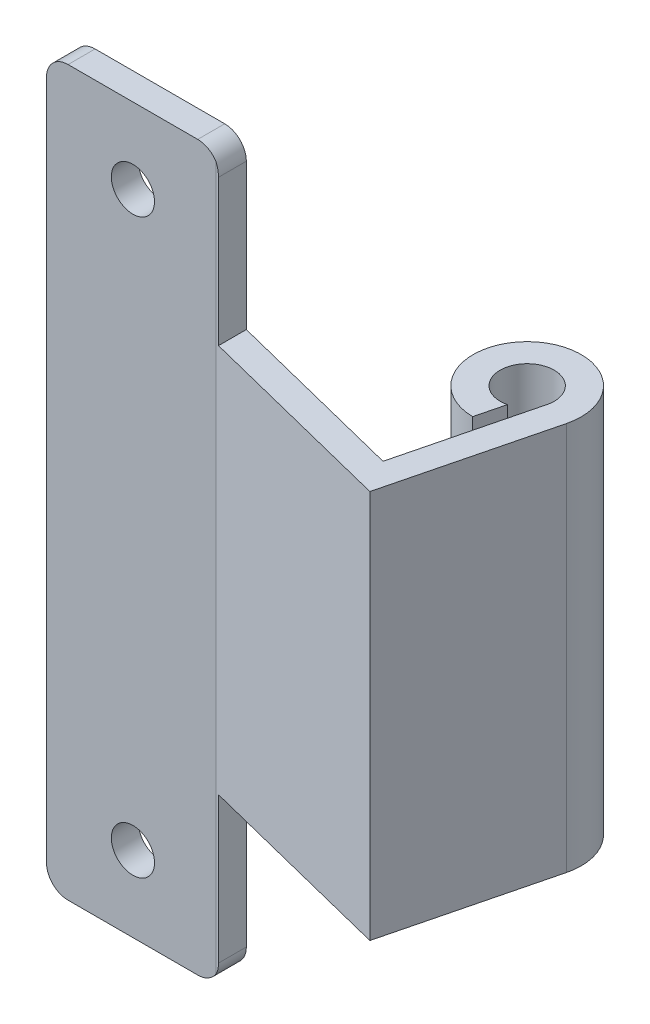
ISO-10303-21;
HEADER;
FILE_DESCRIPTION(('STEP AP214'),'2;1');
FILE_NAME('part.step','',(''),(''),'','','');
FILE_SCHEMA(('AUTOMOTIVE_DESIGN { 1 0 10303 214 1 1 1 1 }'));
ENDSEC;
DATA;
#1=APPLICATION_CONTEXT('core data for automotive mechanical design processes');
#2=APPLICATION_PROTOCOL_DEFINITION('international standard','automotive_design',2000,#1);
#3=PRODUCT_CONTEXT('',#1,'mechanical');
#4=PRODUCT('Part','Part','',(#3));
#5=PRODUCT_RELATED_PRODUCT_CATEGORY('part','',(#4));
#6=PRODUCT_DEFINITION_FORMATION('','',#4);
#7=PRODUCT_DEFINITION_CONTEXT('part definition',#1,'design');
#8=PRODUCT_DEFINITION('design','',#6,#7);
#9=PRODUCT_DEFINITION_SHAPE('','',#8);
#10=(LENGTH_UNIT() NAMED_UNIT(*) SI_UNIT(.MILLI.,.METRE.));
#11=(NAMED_UNIT(*) PLANE_ANGLE_UNIT() SI_UNIT($,.RADIAN.));
#12=(NAMED_UNIT(*) SI_UNIT($,.STERADIAN.) SOLID_ANGLE_UNIT());
#13=UNCERTAINTY_MEASURE_WITH_UNIT(LENGTH_MEASURE(1.E-05),#10,'distance_accuracy_value','');
#14=(GEOMETRIC_REPRESENTATION_CONTEXT(3) GLOBAL_UNCERTAINTY_ASSIGNED_CONTEXT((#13)) GLOBAL_UNIT_ASSIGNED_CONTEXT((#10,
#11,#12)) REPRESENTATION_CONTEXT('',''));
#15=CARTESIAN_POINT('',(0.,0.,0.));
#16=DIRECTION('',(0.,0.,1.));
#17=DIRECTION('',(1.,0.,0.));
#18=AXIS2_PLACEMENT_3D('',#15,#16,#17);
#19=CARTESIAN_POINT('',(0.,33.5,0.));
#20=DIRECTION('',(0.,-1.,0.));
#21=DIRECTION('',(0.,0.,-1.));
#22=AXIS2_PLACEMENT_3D('',#19,#20,#21);
#23=CYLINDRICAL_SURFACE('',#22,5.);
#24=CARTESIAN_POINT('',(0.,18.,0.));
#25=DIRECTION('',(0.,-1.,0.));
#26=DIRECTION('',(1.,0.,0.));
#27=AXIS2_PLACEMENT_3D('',#24,#25,#26);
#28=CIRCLE('',#27,5.);
#29=CARTESIAN_POINT('',(-0.0442396130389852,18.,4.99980428183326));
#30=VERTEX_POINT('',#29);
#31=CARTESIAN_POINT('',(4.84994585902011,18.,1.21574058276166));
#32=VERTEX_POINT('',#31);
#33=EDGE_CURVE('E345',#30,#32,#28,.T.);
#34=ORIENTED_EDGE('',*,*,#33,.T.);
#35=DIRECTION('',(0.,-1.,0.));
#36=VECTOR('',#35,1.);
#37=CARTESIAN_POINT('',(4.84994585902011,33.5,1.21574058276166));
#38=LINE('',#37,#36);
#39=CARTESIAN_POINT('',(4.84994585902011,-18.,1.21574058276166));
#40=VERTEX_POINT('',#39);
#41=EDGE_CURVE('E181',#32,#40,#38,.T.);
#42=ORIENTED_EDGE('',*,*,#41,.T.);
#43=CARTESIAN_POINT('',(0.,-18.,0.));
#44=DIRECTION('',(0.,1.,0.));
#45=DIRECTION('',(-1.,0.,0.));
#46=AXIS2_PLACEMENT_3D('',#43,#44,#45);
#47=CIRCLE('',#46,5.);
#48=CARTESIAN_POINT('',(-0.0442396130389852,-18.,4.99980428183326));
#49=VERTEX_POINT('',#48);
#50=EDGE_CURVE('E159',#40,#49,#47,.T.);
#51=ORIENTED_EDGE('',*,*,#50,.T.);
#52=DIRECTION('',(0.,-1.,0.));
#53=VECTOR('',#52,1.);
#54=CARTESIAN_POINT('',(-0.0442396130389852,33.5,4.99980428183326));
#55=LINE('',#54,#53);
#56=EDGE_CURVE('E165',#30,#49,#55,.T.);
#57=ORIENTED_EDGE('',*,*,#56,.F.);
#58=EDGE_LOOP('',(#34,#42,#51,#57));
#59=FACE_BOUND('',#58,.T.);
#60=ADVANCED_FACE('F32',(#59),#23,.T.);
#61=CARTESIAN_POINT('',(0.600751285631108,33.5,2.42674635938999));
#62=DIRECTION('',(-0.969989171804022,0.,-0.243148116552332));
#63=DIRECTION('',(-0.243148116552332,0.,0.969989171804023));
#64=AXIS2_PLACEMENT_3D('',#61,#62,#63);
#65=PLANE('',#64);
#66=DIRECTION('',(0.,-1.,0.));
#67=VECTOR('',#66,1.);
#68=CARTESIAN_POINT('',(0.600751285631108,33.5,2.42674635938999));
#69=LINE('',#68,#67);
#70=CARTESIAN_POINT('',(0.600751285631108,18.,2.42674635938999));
#71=VERTEX_POINT('',#70);
#72=CARTESIAN_POINT('',(0.600751285631108,-18.,2.42674635938999));
#73=VERTEX_POINT('',#72);
#74=EDGE_CURVE('E203',#71,#73,#69,.T.);
#75=ORIENTED_EDGE('',*,*,#74,.F.);
#76=DIRECTION('',(-0.243148116552332,0.,0.969989171804023));
#77=VECTOR('',#76,1.);
#78=CARTESIAN_POINT('',(0.600751285631108,18.,2.42674635938999));
#79=LINE('',#78,#77);
#80=EDGE_CURVE('E347',#71,#30,#79,.T.);
#81=ORIENTED_EDGE('',*,*,#80,.T.);
#82=ORIENTED_EDGE('',*,*,#56,.T.);
#83=DIRECTION('',(0.243148116552332,0.,-0.969989171804023));
#84=VECTOR('',#83,1.);
#85=CARTESIAN_POINT('',(0.600751285631108,-18.,2.42674635938999));
#86=LINE('',#85,#84);
#87=EDGE_CURVE('E331',#49,#73,#86,.T.);
#88=ORIENTED_EDGE('',*,*,#87,.T.);
#89=EDGE_LOOP('',(#75,#81,#82,#88));
#90=FACE_BOUND('',#89,.T.);
#91=ADVANCED_FACE('F296',(#90),#65,.F.);
#92=CARTESIAN_POINT('',(0.,33.5,0.));
#93=DIRECTION('',(0.,-1.,0.));
#94=DIRECTION('',(0.,0.,-1.));
#95=AXIS2_PLACEMENT_3D('',#92,#93,#94);
#96=CYLINDRICAL_SURFACE('',#95,2.5);
#97=DIRECTION('',(0.,-1.,0.));
#98=VECTOR('',#97,1.);
#99=CARTESIAN_POINT('',(2.42497292951006,33.5,0.60787029138083));
#100=LINE('',#99,#98);
#101=CARTESIAN_POINT('',(2.42497292951006,18.,0.60787029138083));
#102=VERTEX_POINT('',#101);
#103=CARTESIAN_POINT('',(2.42497292951006,-18.,0.60787029138083));
#104=VERTEX_POINT('',#103);
#105=EDGE_CURVE('E200',#102,#104,#100,.T.);
#106=ORIENTED_EDGE('',*,*,#105,.F.);
#107=CARTESIAN_POINT('',(0.,18.,0.));
#108=DIRECTION('',(0.,-1.,0.));
#109=DIRECTION('',(1.,0.,0.));
#110=AXIS2_PLACEMENT_3D('',#107,#108,#109);
#111=CIRCLE('',#110,2.5);
#112=EDGE_CURVE('E350',#102,#71,#111,.F.);
#113=ORIENTED_EDGE('',*,*,#112,.T.);
#114=ORIENTED_EDGE('',*,*,#74,.T.);
#115=CARTESIAN_POINT('',(0.,-18.,0.));
#116=DIRECTION('',(0.,1.,0.));
#117=DIRECTION('',(-1.,0.,0.));
#118=AXIS2_PLACEMENT_3D('',#115,#116,#117);
#119=CIRCLE('',#118,2.5);
#120=EDGE_CURVE('E334',#73,#104,#119,.F.);
#121=ORIENTED_EDGE('',*,*,#120,.T.);
#122=EDGE_LOOP('',(#106,#113,#114,#121));
#123=FACE_BOUND('',#122,.T.);
#124=ADVANCED_FACE('F302',(#123),#96,.F.);
#125=CARTESIAN_POINT('',(2.42497292951006,33.5,0.607870291380829));
#126=DIRECTION('',(0.969989171804022,0.,0.243148116552332));
#127=DIRECTION('',(0.243148116552332,0.,-0.969989171804023));
#128=AXIS2_PLACEMENT_3D('',#125,#126,#127);
#129=PLANE('',#128);
#130=DIRECTION('',(0.,-1.,0.));
#131=VECTOR('',#130,1.);
#132=CARTESIAN_POINT('',(-0.614378527394092,33.5,12.7327349389311));
#133=LINE('',#132,#131);
#134=CARTESIAN_POINT('',(-0.614378527394092,18.,12.7327349389311));
#135=VERTEX_POINT('',#134);
#136=CARTESIAN_POINT('',(-0.614378527394092,-18.,12.7327349389311));
#137=VERTEX_POINT('',#136);
#138=EDGE_CURVE('E197',#135,#137,#133,.T.);
#139=ORIENTED_EDGE('',*,*,#138,.F.);
#140=DIRECTION('',(0.243148116552332,0.,-0.969989171804023));
#141=VECTOR('',#140,1.);
#142=CARTESIAN_POINT('',(2.42497292951006,18.,0.60787029138083));
#143=LINE('',#142,#141);
#144=EDGE_CURVE('E353',#135,#102,#143,.T.);
#145=ORIENTED_EDGE('',*,*,#144,.T.);
#146=ORIENTED_EDGE('',*,*,#105,.T.);
#147=DIRECTION('',(-0.243148116552332,0.,0.969989171804023));
#148=VECTOR('',#147,1.);
#149=CARTESIAN_POINT('',(2.42497292951006,-18.,0.60787029138083));
#150=LINE('',#149,#148);
#151=EDGE_CURVE('E337',#104,#137,#150,.T.);
#152=ORIENTED_EDGE('',*,*,#151,.T.);
#153=EDGE_LOOP('',(#139,#145,#146,#152));
#154=FACE_BOUND('',#153,.T.);
#155=ADVANCED_FACE('F364',(#154),#129,.F.);
#156=CARTESIAN_POINT('',(-0.614378527394092,33.5,12.7327349389311));
#157=DIRECTION('',(-0.243148116552332,0.,0.969989171804022));
#158=DIRECTION('',(0.969989171804023,0.,0.243148116552332));
#159=AXIS2_PLACEMENT_3D('',#156,#157,#158);
#160=PLANE('',#159);
#161=DIRECTION('',(0.,-1.,0.));
#162=VECTOR('',#161,1.);
#163=CARTESIAN_POINT('',(-17.5,33.5,8.5));
#164=LINE('',#163,#162);
#165=CARTESIAN_POINT('',(-17.5,18.,8.5));
#166=VERTEX_POINT('',#165);
#167=CARTESIAN_POINT('',(-17.5,-18.,8.5));
#168=VERTEX_POINT('',#167);
#169=EDGE_CURVE('E194',#166,#168,#164,.T.);
#170=ORIENTED_EDGE('',*,*,#169,.F.);
#171=DIRECTION('',(0.969989171804023,0.,0.243148116552332));
#172=VECTOR('',#171,1.);
#173=CARTESIAN_POINT('',(-0.614378527394096,18.,12.7327349389311));
#174=LINE('',#173,#172);
#175=EDGE_CURVE('E270',#166,#135,#174,.T.);
#176=ORIENTED_EDGE('',*,*,#175,.T.);
#177=ORIENTED_EDGE('',*,*,#138,.T.);
#178=DIRECTION('',(-0.969989171804023,0.,-0.243148116552332));
#179=VECTOR('',#178,1.);
#180=CARTESIAN_POINT('',(-0.614378527394096,-18.,12.7327349389311));
#181=LINE('',#180,#179);
#182=EDGE_CURVE('E340',#137,#168,#181,.T.);
#183=ORIENTED_EDGE('',*,*,#182,.T.);
#184=EDGE_LOOP('',(#170,#176,#177,#183));
#185=FACE_BOUND('',#184,.T.);
#186=ADVANCED_FACE('F359',(#185),#160,.F.);
#187=CARTESIAN_POINT('',(-17.5,33.5,8.5));
#188=DIRECTION('',(0.,0.,1.));
#189=DIRECTION('',(1.,0.,0.));
#190=AXIS2_PLACEMENT_3D('',#187,#188,#189);
#191=PLANE('',#190);
#192=CARTESIAN_POINT('',(-25.5,26.5,8.5));
#193=DIRECTION('',(0.,0.,-1.));
#194=DIRECTION('',(-1.,0.,0.));
#195=AXIS2_PLACEMENT_3D('',#192,#193,#194);
#196=CIRCLE('',#195,2.);
#197=CARTESIAN_POINT('',(-27.5,26.5,8.5));
#198=VERTEX_POINT('',#197);
#199=EDGE_CURVE('E214',#198,#198,#196,.T.);
#200=ORIENTED_EDGE('',*,*,#199,.F.);
#201=EDGE_LOOP('',(#200));
#202=FACE_BOUND('',#201,.T.);
#203=CARTESIAN_POINT('',(-25.5,-26.5,8.5));
#204=DIRECTION('',(0.,0.,-1.));
#205=DIRECTION('',(1.,0.,0.));
#206=AXIS2_PLACEMENT_3D('',#203,#204,#205);
#207=CIRCLE('',#206,2.);
#208=CARTESIAN_POINT('',(-23.5,-26.5,8.5));
#209=VERTEX_POINT('',#208);
#210=EDGE_CURVE('E375',#209,#209,#207,.T.);
#211=ORIENTED_EDGE('',*,*,#210,.F.);
#212=EDGE_LOOP('',(#211));
#213=FACE_BOUND('',#212,.T.);
#214=DIRECTION('',(0.,-1.,0.));
#215=VECTOR('',#214,1.);
#216=CARTESIAN_POINT('',(-17.5,33.5,8.5));
#217=LINE('',#216,#215);
#218=CARTESIAN_POINT('',(-17.5,-31.5,8.5));
#219=VERTEX_POINT('',#218);
#220=EDGE_CURVE('E320',#168,#219,#217,.T.);
#221=ORIENTED_EDGE('',*,*,#220,.T.);
#222=CARTESIAN_POINT('',(-19.5,-31.5,8.5));
#223=DIRECTION('',(0.,0.,1.));
#224=DIRECTION('',(1.,0.,0.));
#225=AXIS2_PLACEMENT_3D('',#222,#223,#224);
#226=CIRCLE('',#225,2.);
#227=CARTESIAN_POINT('',(-19.5,-33.5,8.5));
#228=VERTEX_POINT('',#227);
#229=EDGE_CURVE('E240',#219,#228,#226,.F.);
#230=ORIENTED_EDGE('',*,*,#229,.T.);
#231=DIRECTION('',(-1.,0.,0.));
#232=VECTOR('',#231,1.);
#233=CARTESIAN_POINT('',(-17.5,-33.5,8.5));
#234=LINE('',#233,#232);
#235=CARTESIAN_POINT('',(-31.5,-33.5,8.5));
#236=VERTEX_POINT('',#235);
#237=EDGE_CURVE('E268',#228,#236,#234,.T.);
#238=ORIENTED_EDGE('',*,*,#237,.T.);
#239=CARTESIAN_POINT('',(-31.5,-31.5,8.5));
#240=DIRECTION('',(0.,0.,1.));
#241=DIRECTION('',(1.,0.,0.));
#242=AXIS2_PLACEMENT_3D('',#239,#240,#241);
#243=CIRCLE('',#242,2.);
#244=CARTESIAN_POINT('',(-33.5,-31.5,8.5));
#245=VERTEX_POINT('',#244);
#246=EDGE_CURVE('E238',#236,#245,#243,.F.);
#247=ORIENTED_EDGE('',*,*,#246,.T.);
#248=DIRECTION('',(0.,-1.,0.));
#249=VECTOR('',#248,1.);
#250=CARTESIAN_POINT('',(-33.5,33.5,8.5));
#251=LINE('',#250,#249);
#252=CARTESIAN_POINT('',(-33.5,31.5,8.5));
#253=VERTEX_POINT('',#252);
#254=EDGE_CURVE('E191',#253,#245,#251,.T.);
#255=ORIENTED_EDGE('',*,*,#254,.F.);
#256=CARTESIAN_POINT('',(-31.5,31.5,8.5));
#257=DIRECTION('',(0.,0.,1.));
#258=DIRECTION('',(1.,0.,0.));
#259=AXIS2_PLACEMENT_3D('',#256,#257,#258);
#260=CIRCLE('',#259,2.);
#261=CARTESIAN_POINT('',(-31.5,33.5,8.5));
#262=VERTEX_POINT('',#261);
#263=EDGE_CURVE('E53',#253,#262,#260,.F.);
#264=ORIENTED_EDGE('',*,*,#263,.T.);
#265=DIRECTION('',(-1.,0.,0.));
#266=VECTOR('',#265,1.);
#267=CARTESIAN_POINT('',(-17.5,33.5,8.5));
#268=LINE('',#267,#266);
#269=CARTESIAN_POINT('',(-19.5,33.5,8.5));
#270=VERTEX_POINT('',#269);
#271=EDGE_CURVE('E255',#270,#262,#268,.T.);
#272=ORIENTED_EDGE('',*,*,#271,.F.);
#273=CARTESIAN_POINT('',(-19.5,31.5,8.5));
#274=DIRECTION('',(0.,0.,1.));
#275=DIRECTION('',(1.,0.,0.));
#276=AXIS2_PLACEMENT_3D('',#273,#274,#275);
#277=CIRCLE('',#276,2.);
#278=CARTESIAN_POINT('',(-17.5,31.5,8.5));
#279=VERTEX_POINT('',#278);
#280=EDGE_CURVE('E47',#270,#279,#277,.F.);
#281=ORIENTED_EDGE('',*,*,#280,.T.);
#282=EDGE_CURVE('E195',#279,#166,#164,.T.);
#283=ORIENTED_EDGE('',*,*,#282,.T.);
#284=ORIENTED_EDGE('',*,*,#169,.T.);
#285=EDGE_LOOP('',(#221,#230,#238,#247,#255,#264,#272,#281,#283,#284));
#286=FACE_BOUND('',#285,.T.);
#287=ADVANCED_FACE('F282',(#202,#213,#286),#191,.F.);
#288=CARTESIAN_POINT('',(-33.5,33.5,8.5));
#289=DIRECTION('',(1.,0.,0.));
#290=DIRECTION('',(0.,0.,-1.));
#291=AXIS2_PLACEMENT_3D('',#288,#289,#290);
#292=PLANE('',#291);
#293=ORIENTED_EDGE('',*,*,#254,.T.);
#294=DIRECTION('',(0.,0.,1.));
#295=VECTOR('',#294,1.);
#296=CARTESIAN_POINT('',(-33.5,-31.5,8.5));
#297=LINE('',#296,#295);
#298=CARTESIAN_POINT('',(-33.5,-31.5,11.));
#299=VERTEX_POINT('',#298);
#300=EDGE_CURVE('E244',#245,#299,#297,.T.);
#301=ORIENTED_EDGE('',*,*,#300,.T.);
#302=DIRECTION('',(0.,-1.,0.));
#303=VECTOR('',#302,1.);
#304=CARTESIAN_POINT('',(-33.5,33.5,11.));
#305=LINE('',#304,#303);
#306=CARTESIAN_POINT('',(-33.5,31.5,11.));
#307=VERTEX_POINT('',#306);
#308=EDGE_CURVE('E183',#307,#299,#305,.T.);
#309=ORIENTED_EDGE('',*,*,#308,.F.);
#310=DIRECTION('',(0.,0.,1.));
#311=VECTOR('',#310,1.);
#312=CARTESIAN_POINT('',(-33.5,31.5,8.5));
#313=LINE('',#312,#311);
#314=EDGE_CURVE('E242',#307,#253,#313,.F.);
#315=ORIENTED_EDGE('',*,*,#314,.T.);
#316=EDGE_LOOP('',(#293,#301,#309,#315));
#317=FACE_BOUND('',#316,.T.);
#318=ADVANCED_FACE('F284',(#317),#292,.F.);
#319=CARTESIAN_POINT('',(-17.8085652957291,33.5,11.));
#320=DIRECTION('',(0.,0.,-1.));
#321=DIRECTION('',(-1.,0.,0.));
#322=AXIS2_PLACEMENT_3D('',#319,#320,#321);
#323=PLANE('',#322);
#324=CARTESIAN_POINT('',(-25.5,26.5,11.));
#325=DIRECTION('',(0.,0.,-1.));
#326=DIRECTION('',(-1.,0.,0.));
#327=AXIS2_PLACEMENT_3D('',#324,#325,#326);
#328=CIRCLE('',#327,2.);
#329=CARTESIAN_POINT('',(-27.5,26.5,11.));
#330=VERTEX_POINT('',#329);
#331=EDGE_CURVE('E213',#330,#330,#328,.T.);
#332=ORIENTED_EDGE('',*,*,#331,.T.);
#333=EDGE_LOOP('',(#332));
#334=FACE_BOUND('',#333,.T.);
#335=CARTESIAN_POINT('',(-25.5,-26.5,11.));
#336=DIRECTION('',(0.,0.,-1.));
#337=DIRECTION('',(-1.,0.,0.));
#338=AXIS2_PLACEMENT_3D('',#335,#336,#337);
#339=CIRCLE('',#338,2.);
#340=CARTESIAN_POINT('',(-27.5,-26.5,11.));
#341=VERTEX_POINT('',#340);
#342=EDGE_CURVE('E210',#341,#341,#339,.T.);
#343=ORIENTED_EDGE('',*,*,#342,.T.);
#344=EDGE_LOOP('',(#343));
#345=FACE_BOUND('',#344,.T.);
#346=DIRECTION('',(1.,0.,0.));
#347=VECTOR('',#346,1.);
#348=CARTESIAN_POINT('',(-17.8085652957291,-33.5,11.));
#349=LINE('',#348,#347);
#350=CARTESIAN_POINT('',(-31.5,-33.5,11.));
#351=VERTEX_POINT('',#350);
#352=CARTESIAN_POINT('',(-19.5,-33.5,11.));
#353=VERTEX_POINT('',#352);
#354=EDGE_CURVE('E264',#351,#353,#349,.T.);
#355=ORIENTED_EDGE('',*,*,#354,.T.);
#356=CARTESIAN_POINT('',(-19.5,-31.5,11.));
#357=DIRECTION('',(0.,0.,-1.));
#358=DIRECTION('',(-1.,0.,0.));
#359=AXIS2_PLACEMENT_3D('',#356,#357,#358);
#360=CIRCLE('',#359,2.);
#361=CARTESIAN_POINT('',(-17.8085652957291,-32.5672622176335,11.));
#362=VERTEX_POINT('',#361);
#363=EDGE_CURVE('E228',#353,#362,#360,.F.);
#364=ORIENTED_EDGE('',*,*,#363,.T.);
#365=DIRECTION('',(0.,-1.,0.));
#366=VECTOR('',#365,1.);
#367=CARTESIAN_POINT('',(-17.8085652957291,33.5,11.));
#368=LINE('',#367,#366);
#369=CARTESIAN_POINT('',(-17.8085652957291,32.5672622176335,11.));
#370=VERTEX_POINT('',#369);
#371=EDGE_CURVE('E180',#370,#362,#368,.T.);
#372=ORIENTED_EDGE('',*,*,#371,.F.);
#373=CARTESIAN_POINT('',(-19.5,31.5,11.));
#374=DIRECTION('',(0.,0.,-1.));
#375=DIRECTION('',(-1.,0.,0.));
#376=AXIS2_PLACEMENT_3D('',#373,#374,#375);
#377=CIRCLE('',#376,2.);
#378=CARTESIAN_POINT('',(-19.5,33.5,11.));
#379=VERTEX_POINT('',#378);
#380=EDGE_CURVE('E222',#370,#379,#377,.F.);
#381=ORIENTED_EDGE('',*,*,#380,.T.);
#382=DIRECTION('',(1.,0.,0.));
#383=VECTOR('',#382,1.);
#384=CARTESIAN_POINT('',(-17.8085652957291,33.5,11.));
#385=LINE('',#384,#383);
#386=CARTESIAN_POINT('',(-31.5,33.5,11.));
#387=VERTEX_POINT('',#386);
#388=EDGE_CURVE('E185',#387,#379,#385,.T.);
#389=ORIENTED_EDGE('',*,*,#388,.F.);
#390=CARTESIAN_POINT('',(-31.5,31.5,11.));
#391=DIRECTION('',(0.,0.,-1.));
#392=DIRECTION('',(-1.,0.,0.));
#393=AXIS2_PLACEMENT_3D('',#390,#391,#392);
#394=CIRCLE('',#393,2.);
#395=EDGE_CURVE('E224',#387,#307,#394,.F.);
#396=ORIENTED_EDGE('',*,*,#395,.T.);
#397=ORIENTED_EDGE('',*,*,#308,.T.);
#398=CARTESIAN_POINT('',(-31.5,-31.5,11.));
#399=DIRECTION('',(0.,0.,-1.));
#400=DIRECTION('',(-1.,0.,0.));
#401=AXIS2_PLACEMENT_3D('',#398,#399,#400);
#402=CIRCLE('',#401,2.);
#403=EDGE_CURVE('E226',#299,#351,#402,.F.);
#404=ORIENTED_EDGE('',*,*,#403,.T.);
#405=EDGE_LOOP('',(#355,#364,#372,#381,#389,#396,#397,#404));
#406=FACE_BOUND('',#405,.T.);
#407=ADVANCED_FACE('F259',(#334,#345,#406),#323,.F.);
#408=CARTESIAN_POINT('',(1.20272411073514,33.5,15.765578159822));
#409=DIRECTION('',(0.243148116552332,0.,-0.969989171804022));
#410=DIRECTION('',(-0.969989171804023,0.,-0.243148116552332));
#411=AXIS2_PLACEMENT_3D('',#408,#409,#410);
#412=PLANE('',#411);
#413=ORIENTED_EDGE('',*,*,#371,.T.);
#414=CARTESIAN_POINT('',(-19.5,-31.5,10.5760064394844));
#415=DIRECTION('',(0.243148116552332,0.,-0.969989171804022));
#416=DIRECTION('',(0.969989171804023,0.,0.243148116552332));
#417=AXIS2_PLACEMENT_3D('',#414,#415,#416);
#418=ELLIPSE('',#417,2.06187868703763,2.);
#419=CARTESIAN_POINT('',(-17.5,-31.5,11.077348358797));
#420=VERTEX_POINT('',#419);
#421=EDGE_CURVE('E232',#362,#420,#418,.F.);
#422=ORIENTED_EDGE('',*,*,#421,.T.);
#423=DIRECTION('',(0.,1.,0.));
#424=VECTOR('',#423,1.);
#425=CARTESIAN_POINT('',(-17.5,33.5,11.077348358797));
#426=LINE('',#425,#424);
#427=CARTESIAN_POINT('',(-17.5,-18.,11.077348358797));
#428=VERTEX_POINT('',#427);
#429=EDGE_CURVE('E174',#420,#428,#426,.T.);
#430=ORIENTED_EDGE('',*,*,#429,.T.);
#431=DIRECTION('',(0.969989171804023,0.,0.243148116552332));
#432=VECTOR('',#431,1.);
#433=CARTESIAN_POINT('',(1.20272411073513,-18.,15.765578159822));
#434=LINE('',#433,#432);
#435=CARTESIAN_POINT('',(1.20272411073514,-18.,15.765578159822));
#436=VERTEX_POINT('',#435);
#437=EDGE_CURVE('E156',#428,#436,#434,.T.);
#438=ORIENTED_EDGE('',*,*,#437,.T.);
#439=DIRECTION('',(0.,-1.,0.));
#440=VECTOR('',#439,1.);
#441=CARTESIAN_POINT('',(1.20272411073514,33.5,15.765578159822));
#442=LINE('',#441,#440);
#443=CARTESIAN_POINT('',(1.20272411073514,18.,15.765578159822));
#444=VERTEX_POINT('',#443);
#445=EDGE_CURVE('E172',#444,#436,#442,.T.);
#446=ORIENTED_EDGE('',*,*,#445,.F.);
#447=DIRECTION('',(-0.969989171804023,0.,-0.243148116552332));
#448=VECTOR('',#447,1.);
#449=CARTESIAN_POINT('',(1.20272411073513,18.,15.765578159822));
#450=LINE('',#449,#448);
#451=CARTESIAN_POINT('',(-17.5,18.,11.077348358797));
#452=VERTEX_POINT('',#451);
#453=EDGE_CURVE('E343',#444,#452,#450,.T.);
#454=ORIENTED_EDGE('',*,*,#453,.T.);
#455=DIRECTION('',(0.,1.,0.));
#456=VECTOR('',#455,1.);
#457=CARTESIAN_POINT('',(-17.5,33.5,11.077348358797));
#458=LINE('',#457,#456);
#459=CARTESIAN_POINT('',(-17.5,31.5,11.077348358797));
#460=VERTEX_POINT('',#459);
#461=EDGE_CURVE('E175',#452,#460,#458,.T.);
#462=ORIENTED_EDGE('',*,*,#461,.T.);
#463=CARTESIAN_POINT('',(-19.5,31.5,10.5760064394844));
#464=DIRECTION('',(0.243148116552332,0.,-0.969989171804022));
#465=DIRECTION('',(-0.969989171804023,0.,-0.243148116552332));
#466=AXIS2_PLACEMENT_3D('',#463,#464,#465);
#467=ELLIPSE('',#466,2.06187868703763,2.);
#468=EDGE_CURVE('E230',#460,#370,#467,.F.);
#469=ORIENTED_EDGE('',*,*,#468,.T.);
#470=EDGE_LOOP('',(#413,#422,#430,#438,#446,#454,#462,#469));
#471=FACE_BOUND('',#470,.T.);
#472=ADVANCED_FACE('F170',(#471),#412,.F.);
#473=CARTESIAN_POINT('',(4.84994585902011,33.5,1.21574058276166));
#474=DIRECTION('',(-0.969989171804022,0.,-0.243148116552332));
#475=DIRECTION('',(-0.243148116552332,0.,0.969989171804023));
#476=AXIS2_PLACEMENT_3D('',#473,#474,#475);
#477=PLANE('',#476);
#478=ORIENTED_EDGE('',*,*,#41,.F.);
#479=DIRECTION('',(-0.243148116552332,0.,0.969989171804023));
#480=VECTOR('',#479,1.);
#481=CARTESIAN_POINT('',(4.84994585902011,18.,1.21574058276166));
#482=LINE('',#481,#480);
#483=EDGE_CURVE('E164',#32,#444,#482,.T.);
#484=ORIENTED_EDGE('',*,*,#483,.T.);
#485=ORIENTED_EDGE('',*,*,#445,.T.);
#486=DIRECTION('',(0.243148116552332,0.,-0.969989171804023));
#487=VECTOR('',#486,1.);
#488=CARTESIAN_POINT('',(4.84994585902011,-18.,1.21574058276166));
#489=LINE('',#488,#487);
#490=EDGE_CURVE('E152',#436,#40,#489,.T.);
#491=ORIENTED_EDGE('',*,*,#490,.T.);
#492=EDGE_LOOP('',(#478,#484,#485,#491));
#493=FACE_BOUND('',#492,.T.);
#494=ADVANCED_FACE('F178',(#493),#477,.F.);
#495=CARTESIAN_POINT('',(0.,33.5,0.));
#496=DIRECTION('',(0.,1.,0.));
#497=DIRECTION('',(0.,0.,1.));
#498=AXIS2_PLACEMENT_3D('',#495,#496,#497);
#499=PLANE('',#498);
#500=ORIENTED_EDGE('',*,*,#271,.T.);
#501=DIRECTION('',(0.,0.,1.));
#502=VECTOR('',#501,1.);
#503=CARTESIAN_POINT('',(-31.5,33.5,11.));
#504=LINE('',#503,#502);
#505=EDGE_CURVE('E40',#262,#387,#504,.T.);
#506=ORIENTED_EDGE('',*,*,#505,.T.);
#507=ORIENTED_EDGE('',*,*,#388,.T.);
#508=DIRECTION('',(0.,0.,1.));
#509=VECTOR('',#508,1.);
#510=CARTESIAN_POINT('',(-19.5,33.5,8.5));
#511=LINE('',#510,#509);
#512=EDGE_CURVE('E247',#379,#270,#511,.F.);
#513=ORIENTED_EDGE('',*,*,#512,.T.);
#514=EDGE_LOOP('',(#500,#506,#507,#513));
#515=FACE_BOUND('',#514,.T.);
#516=ADVANCED_FACE('F253',(#515),#499,.T.);
#517=CARTESIAN_POINT('',(0.,-33.5,0.));
#518=DIRECTION('',(0.,1.,0.));
#519=DIRECTION('',(0.,0.,1.));
#520=AXIS2_PLACEMENT_3D('',#517,#518,#519);
#521=PLANE('',#520);
#522=ORIENTED_EDGE('',*,*,#237,.F.);
#523=DIRECTION('',(0.,0.,1.));
#524=VECTOR('',#523,1.);
#525=CARTESIAN_POINT('',(-19.5,-33.5,0.));
#526=LINE('',#525,#524);
#527=EDGE_CURVE('E219',#228,#353,#526,.T.);
#528=ORIENTED_EDGE('',*,*,#527,.T.);
#529=ORIENTED_EDGE('',*,*,#354,.F.);
#530=DIRECTION('',(0.,0.,1.));
#531=VECTOR('',#530,1.);
#532=CARTESIAN_POINT('',(-31.5,-33.5,0.));
#533=LINE('',#532,#531);
#534=EDGE_CURVE('E209',#351,#236,#533,.F.);
#535=ORIENTED_EDGE('',*,*,#534,.T.);
#536=EDGE_LOOP('',(#522,#528,#529,#535));
#537=FACE_BOUND('',#536,.T.);
#538=ADVANCED_FACE('F275',(#537),#521,.F.);
#539=CARTESIAN_POINT('',(-17.5,-18.,15.765578159822));
#540=DIRECTION('',(0.,1.,0.));
#541=DIRECTION('',(-1.,0.,0.));
#542=AXIS2_PLACEMENT_3D('',#539,#540,#541);
#543=PLANE('',#542);
#544=ORIENTED_EDGE('',*,*,#151,.F.);
#545=ORIENTED_EDGE('',*,*,#120,.F.);
#546=ORIENTED_EDGE('',*,*,#87,.F.);
#547=ORIENTED_EDGE('',*,*,#50,.F.);
#548=ORIENTED_EDGE('',*,*,#490,.F.);
#549=ORIENTED_EDGE('',*,*,#437,.F.);
#550=DIRECTION('',(0.,0.,-1.));
#551=VECTOR('',#550,1.);
#552=CARTESIAN_POINT('',(-17.5,-18.,15.765578159822));
#553=LINE('',#552,#551);
#554=EDGE_CURVE('E217',#428,#168,#553,.T.);
#555=ORIENTED_EDGE('',*,*,#554,.T.);
#556=ORIENTED_EDGE('',*,*,#182,.F.);
#557=EDGE_LOOP('',(#544,#545,#546,#547,#548,#549,#555,#556));
#558=FACE_BOUND('',#557,.T.);
#559=ADVANCED_FACE('F154',(#558),#543,.F.);
#560=CARTESIAN_POINT('',(-17.5,-18.,15.765578159822));
#561=DIRECTION('',(-1.,0.,0.));
#562=DIRECTION('',(0.,0.,1.));
#563=AXIS2_PLACEMENT_3D('',#560,#561,#562);
#564=PLANE('',#563);
#565=ORIENTED_EDGE('',*,*,#429,.F.);
#566=DIRECTION('',(0.,0.,1.));
#567=VECTOR('',#566,1.);
#568=CARTESIAN_POINT('',(-17.5,-31.5,15.765578159822));
#569=LINE('',#568,#567);
#570=EDGE_CURVE('E234',#420,#219,#569,.F.);
#571=ORIENTED_EDGE('',*,*,#570,.T.);
#572=ORIENTED_EDGE('',*,*,#220,.F.);
#573=ORIENTED_EDGE('',*,*,#554,.F.);
#574=EDGE_LOOP('',(#565,#571,#572,#573));
#575=FACE_BOUND('',#574,.T.);
#576=ADVANCED_FACE('F464',(#575),#564,.F.);
#577=CARTESIAN_POINT('',(-17.5,18.,15.765578159822));
#578=DIRECTION('',(0.,-1.,0.));
#579=DIRECTION('',(1.,0.,0.));
#580=AXIS2_PLACEMENT_3D('',#577,#578,#579);
#581=PLANE('',#580);
#582=DIRECTION('',(0.,0.,-1.));
#583=VECTOR('',#582,1.);
#584=CARTESIAN_POINT('',(-17.5,18.,15.765578159822));
#585=LINE('',#584,#583);
#586=EDGE_CURVE('E326',#452,#166,#585,.T.);
#587=ORIENTED_EDGE('',*,*,#586,.F.);
#588=ORIENTED_EDGE('',*,*,#453,.F.);
#589=ORIENTED_EDGE('',*,*,#483,.F.);
#590=ORIENTED_EDGE('',*,*,#33,.F.);
#591=ORIENTED_EDGE('',*,*,#80,.F.);
#592=ORIENTED_EDGE('',*,*,#112,.F.);
#593=ORIENTED_EDGE('',*,*,#144,.F.);
#594=ORIENTED_EDGE('',*,*,#175,.F.);
#595=EDGE_LOOP('',(#587,#588,#589,#590,#591,#592,#593,#594));
#596=FACE_BOUND('',#595,.T.);
#597=ADVANCED_FACE('F369',(#596),#581,.F.);
#598=CARTESIAN_POINT('',(-17.5,18.,15.765578159822));
#599=DIRECTION('',(-1.,0.,0.));
#600=DIRECTION('',(0.,-1.,0.));
#601=AXIS2_PLACEMENT_3D('',#598,#599,#600);
#602=PLANE('',#601);
#603=ORIENTED_EDGE('',*,*,#282,.F.);
#604=DIRECTION('',(0.,0.,1.));
#605=VECTOR('',#604,1.);
#606=CARTESIAN_POINT('',(-17.5,31.5,11.077348358797));
#607=LINE('',#606,#605);
#608=EDGE_CURVE('E11',#279,#460,#607,.T.);
#609=ORIENTED_EDGE('',*,*,#608,.T.);
#610=ORIENTED_EDGE('',*,*,#461,.F.);
#611=ORIENTED_EDGE('',*,*,#586,.T.);
#612=EDGE_LOOP('',(#603,#609,#610,#611));
#613=FACE_BOUND('',#612,.T.);
#614=ADVANCED_FACE('F371',(#613),#602,.F.);
#615=CARTESIAN_POINT('',(-25.5,-26.5,15.765578159822));
#616=DIRECTION('',(0.,0.,-1.));
#617=DIRECTION('',(-1.,0.,0.));
#618=AXIS2_PLACEMENT_3D('',#615,#616,#617);
#619=CYLINDRICAL_SURFACE('',#618,2.);
#620=ORIENTED_EDGE('',*,*,#210,.T.);
#621=EDGE_LOOP('',(#620));
#622=FACE_BOUND('',#621,.T.);
#623=ORIENTED_EDGE('',*,*,#342,.F.);
#624=EDGE_LOOP('',(#623));
#625=FACE_BOUND('',#624,.T.);
#626=ADVANCED_FACE('F313',(#622,#625),#619,.F.);
#627=CARTESIAN_POINT('',(-25.5,26.5,15.765578159822));
#628=DIRECTION('',(0.,0.,-1.));
#629=DIRECTION('',(-1.,0.,0.));
#630=AXIS2_PLACEMENT_3D('',#627,#628,#629);
#631=CYLINDRICAL_SURFACE('',#630,2.);
#632=ORIENTED_EDGE('',*,*,#199,.T.);
#633=EDGE_LOOP('',(#632));
#634=FACE_BOUND('',#633,.T.);
#635=ORIENTED_EDGE('',*,*,#331,.F.);
#636=EDGE_LOOP('',(#635));
#637=FACE_BOUND('',#636,.T.);
#638=ADVANCED_FACE('F308',(#634,#637),#631,.F.);
#639=CARTESIAN_POINT('',(-19.5,-31.5,0.));
#640=DIRECTION('',(0.,0.,1.));
#641=DIRECTION('',(1.,0.,0.));
#642=AXIS2_PLACEMENT_3D('',#639,#640,#641);
#643=CYLINDRICAL_SURFACE('',#642,2.);
#644=ORIENTED_EDGE('',*,*,#229,.F.);
#645=ORIENTED_EDGE('',*,*,#570,.F.);
#646=ORIENTED_EDGE('',*,*,#421,.F.);
#647=ORIENTED_EDGE('',*,*,#363,.F.);
#648=ORIENTED_EDGE('',*,*,#527,.F.);
#649=EDGE_LOOP('',(#644,#645,#646,#647,#648));
#650=FACE_BOUND('',#649,.T.);
#651=ADVANCED_FACE('F293',(#650),#643,.T.);
#652=CARTESIAN_POINT('',(-31.5,-31.5,8.5));
#653=DIRECTION('',(0.,0.,1.));
#654=DIRECTION('',(1.,0.,0.));
#655=AXIS2_PLACEMENT_3D('',#652,#653,#654);
#656=CYLINDRICAL_SURFACE('',#655,2.);
#657=ORIENTED_EDGE('',*,*,#246,.F.);
#658=ORIENTED_EDGE('',*,*,#534,.F.);
#659=ORIENTED_EDGE('',*,*,#403,.F.);
#660=ORIENTED_EDGE('',*,*,#300,.F.);
#661=EDGE_LOOP('',(#657,#658,#659,#660));
#662=FACE_BOUND('',#661,.T.);
#663=ADVANCED_FACE('F279',(#662),#656,.T.);
#664=CARTESIAN_POINT('',(-31.5,31.5,0.));
#665=DIRECTION('',(0.,0.,-1.));
#666=DIRECTION('',(-1.,0.,0.));
#667=AXIS2_PLACEMENT_3D('',#664,#665,#666);
#668=CYLINDRICAL_SURFACE('',#667,2.);
#669=ORIENTED_EDGE('',*,*,#263,.F.);
#670=ORIENTED_EDGE('',*,*,#314,.F.);
#671=ORIENTED_EDGE('',*,*,#395,.F.);
#672=ORIENTED_EDGE('',*,*,#505,.F.);
#673=EDGE_LOOP('',(#669,#670,#671,#672));
#674=FACE_BOUND('',#673,.T.);
#675=ADVANCED_FACE('F286',(#674),#668,.T.);
#676=CARTESIAN_POINT('',(-19.5,31.5,15.765578159822));
#677=DIRECTION('',(0.,0.,-1.));
#678=DIRECTION('',(-1.,0.,0.));
#679=AXIS2_PLACEMENT_3D('',#676,#677,#678);
#680=CYLINDRICAL_SURFACE('',#679,2.);
#681=ORIENTED_EDGE('',*,*,#280,.F.);
#682=ORIENTED_EDGE('',*,*,#512,.F.);
#683=ORIENTED_EDGE('',*,*,#380,.F.);
#684=ORIENTED_EDGE('',*,*,#468,.F.);
#685=ORIENTED_EDGE('',*,*,#608,.F.);
#686=EDGE_LOOP('',(#681,#682,#683,#684,#685));
#687=FACE_BOUND('',#686,.T.);
#688=ADVANCED_FACE('F34',(#687),#680,.T.);
#689=CLOSED_SHELL('',(#60,#91,#124,#155,#186,#287,#318,#407,#472,#494,#516,#538,#559,#576,#597,
#614,#626,#638,#651,#663,#675,#688));
#690=MANIFOLD_SOLID_BREP('B2',#689);
#691=ADVANCED_BREP_SHAPE_REPRESENTATION('',(#18,#690),#14);
#692=SHAPE_DEFINITION_REPRESENTATION(#9,#691);
ENDSEC;
END-ISO-10303-21;
